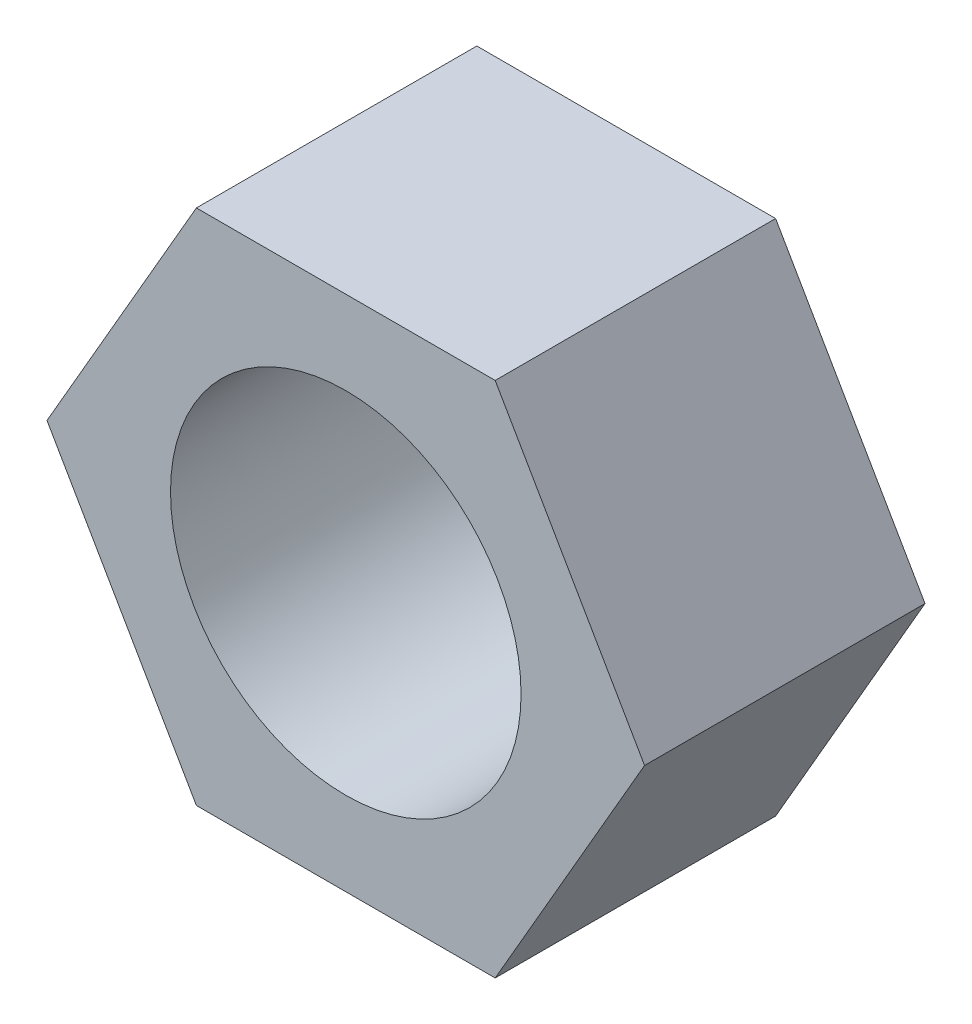
ISO-10303-21;
HEADER;
FILE_DESCRIPTION(('STEP AP214'),'2;1');
FILE_NAME('part.step','',(''),(''),'','','');
FILE_SCHEMA(('AUTOMOTIVE_DESIGN { 1 0 10303 214 1 1 1 1 }'));
ENDSEC;
DATA;
#1=APPLICATION_CONTEXT('core data for automotive mechanical design processes');
#2=APPLICATION_PROTOCOL_DEFINITION('international standard','automotive_design',2000,#1);
#3=PRODUCT_CONTEXT('',#1,'mechanical');
#4=PRODUCT('Part','Part','',(#3));
#5=PRODUCT_RELATED_PRODUCT_CATEGORY('part','',(#4));
#6=PRODUCT_DEFINITION_FORMATION('','',#4);
#7=PRODUCT_DEFINITION_CONTEXT('part definition',#1,'design');
#8=PRODUCT_DEFINITION('design','',#6,#7);
#9=PRODUCT_DEFINITION_SHAPE('','',#8);
#10=(LENGTH_UNIT() NAMED_UNIT(*) SI_UNIT(.MILLI.,.METRE.));
#11=(NAMED_UNIT(*) PLANE_ANGLE_UNIT() SI_UNIT($,.RADIAN.));
#12=(NAMED_UNIT(*) SI_UNIT($,.STERADIAN.) SOLID_ANGLE_UNIT());
#13=UNCERTAINTY_MEASURE_WITH_UNIT(LENGTH_MEASURE(1.E-05),#10,'distance_accuracy_value','');
#14=(GEOMETRIC_REPRESENTATION_CONTEXT(3) GLOBAL_UNCERTAINTY_ASSIGNED_CONTEXT((#13)) GLOBAL_UNIT_ASSIGNED_CONTEXT((#10,
#11,#12)) REPRESENTATION_CONTEXT('',''));
#15=CARTESIAN_POINT('',(0.,0.,0.));
#16=DIRECTION('',(0.,0.,1.));
#17=DIRECTION('',(1.,0.,0.));
#18=AXIS2_PLACEMENT_3D('',#15,#16,#17);
#19=CARTESIAN_POINT('',(0.,0.,4.));
#20=DIRECTION('',(0.,0.,1.));
#21=DIRECTION('',(1.,0.,0.));
#22=AXIS2_PLACEMENT_3D('',#19,#20,#21);
#23=PLANE('',#22);
#24=DIRECTION('',(0.499999999999995,0.866025403784442,0.));
#25=VECTOR('',#24,1.);
#26=CARTESIAN_POINT('',(-75.6508184644855,74.090871292103,4.));
#27=LINE('',#26,#25);
#28=CARTESIAN_POINT('',(-75.6508184644855,74.090871292103,4.));
#29=VERTEX_POINT('',#28);
#30=CARTESIAN_POINT('',(-73.5198909984504,77.7817459305198,4.));
#31=VERTEX_POINT('',#30);
#32=EDGE_CURVE('E129',#29,#31,#27,.T.);
#33=ORIENTED_EDGE('',*,*,#32,.T.);
#34=DIRECTION('',(-0.5,0.866025403784439,0.));
#35=VECTOR('',#34,1.);
#36=CARTESIAN_POINT('',(-73.5198909984504,77.7817459305198,4.));
#37=LINE('',#36,#35);
#38=CARTESIAN_POINT('',(-75.6508184644855,81.4726205689366,4.));
#39=VERTEX_POINT('',#38);
#40=EDGE_CURVE('E87',#31,#39,#37,.T.);
#41=ORIENTED_EDGE('',*,*,#40,.T.);
#42=DIRECTION('',(-1.,0.,0.));
#43=VECTOR('',#42,1.);
#44=CARTESIAN_POINT('',(-75.6508184644855,81.4726205689366,4.));
#45=LINE('',#44,#43);
#46=CARTESIAN_POINT('',(-79.9126733965557,81.4726205689366,4.));
#47=VERTEX_POINT('',#46);
#48=EDGE_CURVE('E100',#39,#47,#45,.T.);
#49=ORIENTED_EDGE('',*,*,#48,.T.);
#50=DIRECTION('',(-0.499999999999995,-0.866025403784441,0.));
#51=VECTOR('',#50,1.);
#52=CARTESIAN_POINT('',(-79.9126733965557,81.4726205689366,4.));
#53=LINE('',#52,#51);
#54=CARTESIAN_POINT('',(-82.0436008625908,77.7817459305198,4.));
#55=VERTEX_POINT('',#54);
#56=EDGE_CURVE('E94',#47,#55,#53,.T.);
#57=ORIENTED_EDGE('',*,*,#56,.T.);
#58=DIRECTION('',(0.500000000000006,-0.866025403784435,0.));
#59=VECTOR('',#58,1.);
#60=CARTESIAN_POINT('',(-82.0436008625908,77.7817459305198,4.));
#61=LINE('',#60,#59);
#62=CARTESIAN_POINT('',(-79.9126733965557,74.090871292103,4.));
#63=VERTEX_POINT('',#62);
#64=EDGE_CURVE('E98',#55,#63,#61,.T.);
#65=ORIENTED_EDGE('',*,*,#64,.T.);
#66=DIRECTION('',(1.,0.,0.));
#67=VECTOR('',#66,1.);
#68=CARTESIAN_POINT('',(-79.9126733965557,74.090871292103,4.));
#69=LINE('',#68,#67);
#70=EDGE_CURVE('E50',#63,#29,#69,.T.);
#71=ORIENTED_EDGE('',*,*,#70,.T.);
#72=EDGE_LOOP('',(#33,#41,#49,#57,#65,#71));
#73=FACE_BOUND('',#72,.T.);
#74=CARTESIAN_POINT('',(-77.7817459305206,77.7817459305198,4.));
#75=DIRECTION('',(0.,0.,1.));
#76=DIRECTION('',(1.,0.,0.));
#77=AXIS2_PLACEMENT_3D('',#74,#75,#76);
#78=CIRCLE('',#77,2.50000000000001);
#79=CARTESIAN_POINT('',(-75.2817459305206,77.7817459305198,4.));
#80=VERTEX_POINT('',#79);
#81=EDGE_CURVE('E122',#80,#80,#78,.T.);
#82=ORIENTED_EDGE('',*,*,#81,.F.);
#83=EDGE_LOOP('',(#82));
#84=FACE_BOUND('',#83,.T.);
#85=ADVANCED_FACE('F33',(#73,#84),#23,.T.);
#86=CARTESIAN_POINT('',(0.,0.,0.));
#87=DIRECTION('',(0.,0.,1.));
#88=DIRECTION('',(1.,0.,0.));
#89=AXIS2_PLACEMENT_3D('',#86,#87,#88);
#90=PLANE('',#89);
#91=DIRECTION('',(0.499999999999995,0.866025403784442,0.));
#92=VECTOR('',#91,1.);
#93=CARTESIAN_POINT('',(-75.6508184644855,74.090871292103,0.));
#94=LINE('',#93,#92);
#95=CARTESIAN_POINT('',(-75.6508184644855,74.090871292103,0.));
#96=VERTEX_POINT('',#95);
#97=CARTESIAN_POINT('',(-73.5198909984504,77.7817459305198,0.));
#98=VERTEX_POINT('',#97);
#99=EDGE_CURVE('E118',#96,#98,#94,.T.);
#100=ORIENTED_EDGE('',*,*,#99,.F.);
#101=DIRECTION('',(1.,0.,0.));
#102=VECTOR('',#101,1.);
#103=CARTESIAN_POINT('',(-79.9126733965557,74.090871292103,0.));
#104=LINE('',#103,#102);
#105=CARTESIAN_POINT('',(-79.9126733965557,74.090871292103,0.));
#106=VERTEX_POINT('',#105);
#107=EDGE_CURVE('E79',#106,#96,#104,.T.);
#108=ORIENTED_EDGE('',*,*,#107,.F.);
#109=DIRECTION('',(0.500000000000006,-0.866025403784435,0.));
#110=VECTOR('',#109,1.);
#111=CARTESIAN_POINT('',(-82.0436008625908,77.7817459305198,0.));
#112=LINE('',#111,#110);
#113=CARTESIAN_POINT('',(-82.0436008625908,77.7817459305198,0.));
#114=VERTEX_POINT('',#113);
#115=EDGE_CURVE('E73',#114,#106,#112,.T.);
#116=ORIENTED_EDGE('',*,*,#115,.F.);
#117=DIRECTION('',(-0.499999999999995,-0.866025403784441,0.));
#118=VECTOR('',#117,1.);
#119=CARTESIAN_POINT('',(-79.9126733965557,81.4726205689366,0.));
#120=LINE('',#119,#118);
#121=CARTESIAN_POINT('',(-79.9126733965557,81.4726205689366,0.));
#122=VERTEX_POINT('',#121);
#123=EDGE_CURVE('E108',#122,#114,#120,.T.);
#124=ORIENTED_EDGE('',*,*,#123,.F.);
#125=DIRECTION('',(-1.,0.,0.));
#126=VECTOR('',#125,1.);
#127=CARTESIAN_POINT('',(-75.6508184644855,81.4726205689366,0.));
#128=LINE('',#127,#126);
#129=CARTESIAN_POINT('',(-75.6508184644855,81.4726205689366,0.));
#130=VERTEX_POINT('',#129);
#131=EDGE_CURVE('E124',#130,#122,#128,.T.);
#132=ORIENTED_EDGE('',*,*,#131,.F.);
#133=DIRECTION('',(-0.5,0.866025403784439,0.));
#134=VECTOR('',#133,1.);
#135=CARTESIAN_POINT('',(-73.5198909984504,77.7817459305198,0.));
#136=LINE('',#135,#134);
#137=EDGE_CURVE('E121',#98,#130,#136,.T.);
#138=ORIENTED_EDGE('',*,*,#137,.F.);
#139=EDGE_LOOP('',(#100,#108,#116,#124,#132,#138));
#140=FACE_BOUND('',#139,.T.);
#141=CARTESIAN_POINT('',(-77.7817459305206,77.7817459305198,0.));
#142=DIRECTION('',(0.,0.,1.));
#143=DIRECTION('',(1.,0.,0.));
#144=AXIS2_PLACEMENT_3D('',#141,#142,#143);
#145=CIRCLE('',#144,2.50000000000001);
#146=CARTESIAN_POINT('',(-75.2817459305206,77.7817459305198,0.));
#147=VERTEX_POINT('',#146);
#148=EDGE_CURVE('E222',#147,#147,#145,.T.);
#149=ORIENTED_EDGE('',*,*,#148,.T.);
#150=EDGE_LOOP('',(#149));
#151=FACE_BOUND('',#150,.T.);
#152=ADVANCED_FACE('F138',(#140,#151),#90,.F.);
#153=CARTESIAN_POINT('',(-75.6508184644855,74.090871292103,4.));
#154=DIRECTION('',(-0.866025403784442,0.499999999999995,0.));
#155=DIRECTION('',(-0.499999999999995,-0.866025403784442,0.));
#156=AXIS2_PLACEMENT_3D('',#153,#154,#155);
#157=PLANE('',#156);
#158=ORIENTED_EDGE('',*,*,#99,.T.);
#159=DIRECTION('',(0.,0.,-1.));
#160=VECTOR('',#159,1.);
#161=CARTESIAN_POINT('',(-73.5198909984504,77.7817459305198,4.));
#162=LINE('',#161,#160);
#163=EDGE_CURVE('E11',#31,#98,#162,.T.);
#164=ORIENTED_EDGE('',*,*,#163,.F.);
#165=ORIENTED_EDGE('',*,*,#32,.F.);
#166=DIRECTION('',(0.,0.,-1.));
#167=VECTOR('',#166,1.);
#168=CARTESIAN_POINT('',(-75.6508184644855,74.090871292103,4.));
#169=LINE('',#168,#167);
#170=EDGE_CURVE('E114',#29,#96,#169,.T.);
#171=ORIENTED_EDGE('',*,*,#170,.T.);
#172=EDGE_LOOP('',(#158,#164,#165,#171));
#173=FACE_BOUND('',#172,.T.);
#174=ADVANCED_FACE('F35',(#173),#157,.F.);
#175=CARTESIAN_POINT('',(-73.5198909984504,77.7817459305198,4.));
#176=DIRECTION('',(-0.866025403784439,-0.5,0.));
#177=DIRECTION('',(0.5,-0.866025403784439,0.));
#178=AXIS2_PLACEMENT_3D('',#175,#176,#177);
#179=PLANE('',#178);
#180=ORIENTED_EDGE('',*,*,#137,.T.);
#181=DIRECTION('',(0.,0.,-1.));
#182=VECTOR('',#181,1.);
#183=CARTESIAN_POINT('',(-75.6508184644855,81.4726205689366,4.));
#184=LINE('',#183,#182);
#185=EDGE_CURVE('E42',#39,#130,#184,.T.);
#186=ORIENTED_EDGE('',*,*,#185,.F.);
#187=ORIENTED_EDGE('',*,*,#40,.F.);
#188=ORIENTED_EDGE('',*,*,#163,.T.);
#189=EDGE_LOOP('',(#180,#186,#187,#188));
#190=FACE_BOUND('',#189,.T.);
#191=ADVANCED_FACE('F163',(#190),#179,.F.);
#192=CARTESIAN_POINT('',(-75.6508184644855,81.4726205689366,4.));
#193=DIRECTION('',(0.,-1.,0.));
#194=DIRECTION('',(1.,0.,0.));
#195=AXIS2_PLACEMENT_3D('',#192,#193,#194);
#196=PLANE('',#195);
#197=ORIENTED_EDGE('',*,*,#131,.T.);
#198=DIRECTION('',(0.,0.,-1.));
#199=VECTOR('',#198,1.);
#200=CARTESIAN_POINT('',(-79.9126733965557,81.4726205689366,4.));
#201=LINE('',#200,#199);
#202=EDGE_CURVE('E109',#47,#122,#201,.T.);
#203=ORIENTED_EDGE('',*,*,#202,.F.);
#204=ORIENTED_EDGE('',*,*,#48,.F.);
#205=ORIENTED_EDGE('',*,*,#185,.T.);
#206=EDGE_LOOP('',(#197,#203,#204,#205));
#207=FACE_BOUND('',#206,.T.);
#208=ADVANCED_FACE('F135',(#207),#196,.F.);
#209=CARTESIAN_POINT('',(-79.9126733965557,81.4726205689366,4.));
#210=DIRECTION('',(0.866025403784441,-0.499999999999995,0.));
#211=DIRECTION('',(0.499999999999995,0.866025403784441,0.));
#212=AXIS2_PLACEMENT_3D('',#209,#210,#211);
#213=PLANE('',#212);
#214=ORIENTED_EDGE('',*,*,#123,.T.);
#215=DIRECTION('',(0.,0.,-1.));
#216=VECTOR('',#215,1.);
#217=CARTESIAN_POINT('',(-82.0436008625908,77.7817459305198,4.));
#218=LINE('',#217,#216);
#219=EDGE_CURVE('E105',#55,#114,#218,.T.);
#220=ORIENTED_EDGE('',*,*,#219,.F.);
#221=ORIENTED_EDGE('',*,*,#56,.F.);
#222=ORIENTED_EDGE('',*,*,#202,.T.);
#223=EDGE_LOOP('',(#214,#220,#221,#222));
#224=FACE_BOUND('',#223,.T.);
#225=ADVANCED_FACE('F106',(#224),#213,.F.);
#226=CARTESIAN_POINT('',(-82.0436008625908,77.7817459305198,4.));
#227=DIRECTION('',(0.866025403784435,0.500000000000006,0.));
#228=DIRECTION('',(-0.500000000000006,0.866025403784435,0.));
#229=AXIS2_PLACEMENT_3D('',#226,#227,#228);
#230=PLANE('',#229);
#231=ORIENTED_EDGE('',*,*,#115,.T.);
#232=DIRECTION('',(0.,0.,-1.));
#233=VECTOR('',#232,1.);
#234=CARTESIAN_POINT('',(-79.9126733965557,74.090871292103,4.));
#235=LINE('',#234,#233);
#236=EDGE_CURVE('E110',#63,#106,#235,.T.);
#237=ORIENTED_EDGE('',*,*,#236,.F.);
#238=ORIENTED_EDGE('',*,*,#64,.F.);
#239=ORIENTED_EDGE('',*,*,#219,.T.);
#240=EDGE_LOOP('',(#231,#237,#238,#239));
#241=FACE_BOUND('',#240,.T.);
#242=ADVANCED_FACE('F112',(#241),#230,.F.);
#243=CARTESIAN_POINT('',(-79.9126733965557,74.090871292103,4.));
#244=DIRECTION('',(0.,1.,0.));
#245=DIRECTION('',(-1.,0.,0.));
#246=AXIS2_PLACEMENT_3D('',#243,#244,#245);
#247=PLANE('',#246);
#248=ORIENTED_EDGE('',*,*,#107,.T.);
#249=ORIENTED_EDGE('',*,*,#170,.F.);
#250=ORIENTED_EDGE('',*,*,#70,.F.);
#251=ORIENTED_EDGE('',*,*,#236,.T.);
#252=EDGE_LOOP('',(#248,#249,#250,#251));
#253=FACE_BOUND('',#252,.T.);
#254=ADVANCED_FACE('F143',(#253),#247,.F.);
#255=CARTESIAN_POINT('',(-77.7817459305206,77.7817459305198,4.));
#256=DIRECTION('',(0.,0.,-1.));
#257=DIRECTION('',(-1.,0.,0.));
#258=AXIS2_PLACEMENT_3D('',#255,#256,#257);
#259=CYLINDRICAL_SURFACE('',#258,2.50000000000001);
#260=ORIENTED_EDGE('',*,*,#81,.T.);
#261=EDGE_LOOP('',(#260));
#262=FACE_BOUND('',#261,.T.);
#263=ORIENTED_EDGE('',*,*,#148,.F.);
#264=EDGE_LOOP('',(#263));
#265=FACE_BOUND('',#264,.T.);
#266=ADVANCED_FACE('F145',(#262,#265),#259,.F.);
#267=CLOSED_SHELL('',(#85,#152,#174,#191,#208,#225,#242,#254,#266));
#268=MANIFOLD_SOLID_BREP('B2',#267);
#269=ADVANCED_BREP_SHAPE_REPRESENTATION('',(#18,#268),#14);
#270=SHAPE_DEFINITION_REPRESENTATION(#9,#269);
ENDSEC;
END-ISO-10303-21;
